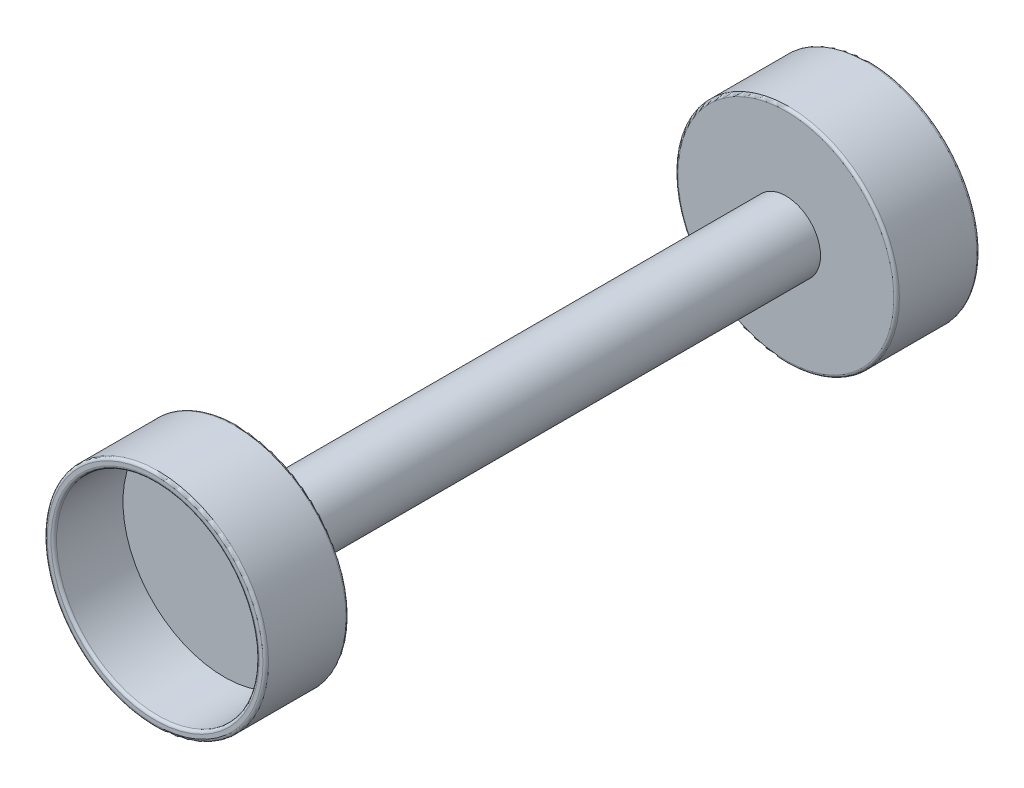
ISO-10303-21;
HEADER;
FILE_DESCRIPTION(('STEP AP214'),'2;1');
FILE_NAME('part.step','',(''),(''),'','','');
FILE_SCHEMA(('AUTOMOTIVE_DESIGN { 1 0 10303 214 1 1 1 1 }'));
ENDSEC;
DATA;
#1=APPLICATION_CONTEXT('core data for automotive mechanical design processes');
#2=APPLICATION_PROTOCOL_DEFINITION('international standard','automotive_design',2000,#1);
#3=PRODUCT_CONTEXT('',#1,'mechanical');
#4=PRODUCT('Part','Part','',(#3));
#5=PRODUCT_RELATED_PRODUCT_CATEGORY('part','',(#4));
#6=PRODUCT_DEFINITION_FORMATION('','',#4);
#7=PRODUCT_DEFINITION_CONTEXT('part definition',#1,'design');
#8=PRODUCT_DEFINITION('design','',#6,#7);
#9=PRODUCT_DEFINITION_SHAPE('','',#8);
#10=(LENGTH_UNIT() NAMED_UNIT(*) SI_UNIT(.MILLI.,.METRE.));
#11=(NAMED_UNIT(*) PLANE_ANGLE_UNIT() SI_UNIT($,.RADIAN.));
#12=(NAMED_UNIT(*) SI_UNIT($,.STERADIAN.) SOLID_ANGLE_UNIT());
#13=UNCERTAINTY_MEASURE_WITH_UNIT(LENGTH_MEASURE(1.E-05),#10,'distance_accuracy_value','');
#14=(GEOMETRIC_REPRESENTATION_CONTEXT(3) GLOBAL_UNCERTAINTY_ASSIGNED_CONTEXT((#13)) GLOBAL_UNIT_ASSIGNED_CONTEXT((#10,
#11,#12)) REPRESENTATION_CONTEXT('',''));
#15=CARTESIAN_POINT('',(0.,0.,0.));
#16=DIRECTION('',(0.,0.,1.));
#17=DIRECTION('',(1.,0.,0.));
#18=AXIS2_PLACEMENT_3D('',#15,#16,#17);
#19=CARTESIAN_POINT('',(0.,0.,251.46));
#20=DIRECTION('',(0.,0.,-1.));
#21=DIRECTION('',(-1.,0.,0.));
#22=AXIS2_PLACEMENT_3D('',#19,#20,#21);
#23=CYLINDRICAL_SURFACE('',#22,31.75);
#24=CARTESIAN_POINT('',(0.,0.,251.46));
#25=DIRECTION('',(0.,0.,1.));
#26=DIRECTION('',(1.,0.,0.));
#27=AXIS2_PLACEMENT_3D('',#24,#25,#26);
#28=CIRCLE('',#27,31.75);
#29=CARTESIAN_POINT('',(31.75,0.,251.46));
#30=VERTEX_POINT('',#29);
#31=EDGE_CURVE('E87',#30,#30,#28,.T.);
#32=ORIENTED_EDGE('',*,*,#31,.F.);
#33=EDGE_LOOP('',(#32));
#34=FACE_BOUND('',#33,.T.);
#35=CARTESIAN_POINT('',(0.,0.,-251.46));
#36=DIRECTION('',(0.,0.,1.));
#37=DIRECTION('',(1.,0.,0.));
#38=AXIS2_PLACEMENT_3D('',#35,#36,#37);
#39=CIRCLE('',#38,31.75);
#40=CARTESIAN_POINT('',(31.75,0.,-251.46));
#41=VERTEX_POINT('',#40);
#42=EDGE_CURVE('E88',#41,#41,#39,.T.);
#43=ORIENTED_EDGE('',*,*,#42,.T.);
#44=EDGE_LOOP('',(#43));
#45=FACE_BOUND('',#44,.T.);
#46=ADVANCED_FACE('F43',(#34,#45),#23,.T.);
#47=CARTESIAN_POINT('',(0.,0.,327.66));
#48=DIRECTION('',(0.,0.,-1.));
#49=DIRECTION('',(-1.,0.,0.));
#50=AXIS2_PLACEMENT_3D('',#47,#48,#49);
#51=CYLINDRICAL_SURFACE('',#50,101.6);
#52=CARTESIAN_POINT('',(0.,0.,254.));
#53=DIRECTION('',(0.,0.,1.));
#54=DIRECTION('',(1.,0.,0.));
#55=AXIS2_PLACEMENT_3D('',#52,#53,#54);
#56=CIRCLE('',#55,101.6);
#57=CARTESIAN_POINT('',(-101.6,0.,254.));
#58=VERTEX_POINT('',#57);
#59=EDGE_CURVE('E75',#58,#58,#56,.T.);
#60=CARTESIAN_POINT('',(0.,0.,325.12));
#61=DIRECTION('',(0.,0.,1.));
#62=DIRECTION('',(1.,0.,0.));
#63=AXIS2_PLACEMENT_3D('',#60,#61,#62);
#64=CIRCLE('',#63,101.6);
#65=CARTESIAN_POINT('',(-101.6,0.,325.12));
#66=VERTEX_POINT('',#65);
#67=EDGE_CURVE('E78',#66,#66,#64,.F.);
#68=CARTESIAN_POINT('',(-101.6,0.,254.));
#69=CARTESIAN_POINT('',(-101.6,0.,254.740833333333));
#70=CARTESIAN_POINT('',(-101.6,0.,255.481666666667));
#71=CARTESIAN_POINT('',(-101.6,0.,256.963333333333));
#72=CARTESIAN_POINT('',(-101.6,0.,257.704166666667));
#73=CARTESIAN_POINT('',(-101.6,0.,259.185833333333));
#74=CARTESIAN_POINT('',(-101.6,0.,259.926666666667));
#75=CARTESIAN_POINT('',(-101.6,0.,261.408333333333));
#76=CARTESIAN_POINT('',(-101.6,0.,262.149166666667));
#77=CARTESIAN_POINT('',(-101.6,0.,263.630833333333));
#78=CARTESIAN_POINT('',(-101.6,0.,264.371666666667));
#79=CARTESIAN_POINT('',(-101.6,0.,265.853333333333));
#80=CARTESIAN_POINT('',(-101.6,0.,266.594166666667));
#81=CARTESIAN_POINT('',(-101.6,0.,268.075833333333));
#82=CARTESIAN_POINT('',(-101.6,0.,268.816666666667));
#83=CARTESIAN_POINT('',(-101.6,0.,270.298333333333));
#84=CARTESIAN_POINT('',(-101.6,0.,271.039166666667));
#85=CARTESIAN_POINT('',(-101.6,0.,272.520833333333));
#86=CARTESIAN_POINT('',(-101.6,0.,273.261666666667));
#87=CARTESIAN_POINT('',(-101.6,0.,274.743333333333));
#88=CARTESIAN_POINT('',(-101.6,0.,275.484166666667));
#89=CARTESIAN_POINT('',(-101.6,0.,276.965833333333));
#90=CARTESIAN_POINT('',(-101.6,0.,277.706666666667));
#91=CARTESIAN_POINT('',(-101.6,0.,279.188333333333));
#92=CARTESIAN_POINT('',(-101.6,0.,279.929166666667));
#93=CARTESIAN_POINT('',(-101.6,0.,281.410833333333));
#94=CARTESIAN_POINT('',(-101.6,0.,282.151666666667));
#95=CARTESIAN_POINT('',(-101.6,0.,283.633333333333));
#96=CARTESIAN_POINT('',(-101.6,0.,284.374166666667));
#97=CARTESIAN_POINT('',(-101.6,0.,285.855833333333));
#98=CARTESIAN_POINT('',(-101.6,0.,286.596666666667));
#99=CARTESIAN_POINT('',(-101.6,0.,288.078333333333));
#100=CARTESIAN_POINT('',(-101.6,0.,288.819166666667));
#101=CARTESIAN_POINT('',(-101.6,0.,290.300833333333));
#102=CARTESIAN_POINT('',(-101.6,0.,291.041666666667));
#103=CARTESIAN_POINT('',(-101.6,0.,292.523333333333));
#104=CARTESIAN_POINT('',(-101.6,0.,293.264166666667));
#105=CARTESIAN_POINT('',(-101.6,0.,294.745833333333));
#106=CARTESIAN_POINT('',(-101.6,0.,295.486666666667));
#107=CARTESIAN_POINT('',(-101.6,0.,296.968333333333));
#108=CARTESIAN_POINT('',(-101.6,0.,297.709166666667));
#109=CARTESIAN_POINT('',(-101.6,0.,299.190833333333));
#110=CARTESIAN_POINT('',(-101.6,0.,299.931666666667));
#111=CARTESIAN_POINT('',(-101.6,0.,301.413333333333));
#112=CARTESIAN_POINT('',(-101.6,0.,302.154166666667));
#113=CARTESIAN_POINT('',(-101.6,0.,303.635833333333));
#114=CARTESIAN_POINT('',(-101.6,0.,304.376666666667));
#115=CARTESIAN_POINT('',(-101.6,0.,305.858333333333));
#116=CARTESIAN_POINT('',(-101.6,0.,306.599166666667));
#117=CARTESIAN_POINT('',(-101.6,0.,308.080833333333));
#118=CARTESIAN_POINT('',(-101.6,0.,308.821666666667));
#119=CARTESIAN_POINT('',(-101.6,0.,310.303333333333));
#120=CARTESIAN_POINT('',(-101.6,0.,311.044166666667));
#121=CARTESIAN_POINT('',(-101.6,0.,312.525833333333));
#122=CARTESIAN_POINT('',(-101.6,0.,313.266666666667));
#123=CARTESIAN_POINT('',(-101.6,0.,314.748333333333));
#124=CARTESIAN_POINT('',(-101.6,0.,315.489166666667));
#125=CARTESIAN_POINT('',(-101.6,0.,316.970833333333));
#126=CARTESIAN_POINT('',(-101.6,0.,317.711666666667));
#127=CARTESIAN_POINT('',(-101.6,0.,319.193333333333));
#128=CARTESIAN_POINT('',(-101.6,0.,319.934166666667));
#129=CARTESIAN_POINT('',(-101.6,0.,321.415833333333));
#130=CARTESIAN_POINT('',(-101.6,0.,322.156666666667));
#131=CARTESIAN_POINT('',(-101.6,0.,323.638333333333));
#132=CARTESIAN_POINT('',(-101.6,0.,324.379166666667));
#133=CARTESIAN_POINT('',(-101.6,0.,325.12));
#134=B_SPLINE_CURVE_WITH_KNOTS('',3,(#68,#69,#70,#71,#72,#73,#74,#75,#76,#77,#78,#79,#80,#81,
#82,#83,#84,#85,#86,#87,#88,#89,#90,#91,#92,#93,#94,#95,#96,#97,#98,#99,#100,#101,#102,#103,
#104,#105,#106,#107,#108,#109,#110,#111,#112,#113,#114,#115,#116,#117,#118,#119,#120,#121,#122,
#123,#124,#125,#126,#127,#128,#129,#130,#131,#132,#133),.UNSPECIFIED.,.F.,.F.,(4,2,2,2,2,2,2,2,
2,2,2,2,2,2,2,2,2,2,2,2,2,2,2,2,2,2,2,2,2,2,2,2,4),(0.,2.22250000000002,4.44500000000003,
6.66749999999999,8.89000000000001,11.1125,13.335,15.5575,17.78,20.0025,22.225,24.4475,26.67,
28.8925,31.115,33.3375,35.56,37.7825000000001,40.005,42.2275,44.45,46.6725,48.895,51.1175,
53.3400000000001,55.5625,57.785,60.0075000000001,62.2300000000001,64.4525,66.675,
68.8975000000001,71.1200000000001),.UNSPECIFIED.);
#135=EDGE_CURVE('BSEAM117',#58,#66,#134,.T.);
#136=ORIENTED_EDGE('',*,*,#59,.T.);
#137=ORIENTED_EDGE('',*,*,#67,.T.);
#138=ORIENTED_EDGE('',*,*,#135,.T.);
#139=ORIENTED_EDGE('',*,*,#135,.F.);
#140=EDGE_LOOP('',(#136,#138,#137,#139));
#141=FACE_BOUND('',#140,.T.);
#142=ADVANCED_FACE('F117',(#141),#51,.T.);
#143=CARTESIAN_POINT('',(0.,0.,327.66));
#144=DIRECTION('',(0.,0.,1.));
#145=DIRECTION('',(1.,0.,0.));
#146=AXIS2_PLACEMENT_3D('',#143,#144,#145);
#147=PLANE('',#146);
#148=CARTESIAN_POINT('',(0.,0.,327.66));
#149=DIRECTION('',(0.,0.,1.));
#150=DIRECTION('',(1.,0.,0.));
#151=AXIS2_PLACEMENT_3D('',#148,#149,#150);
#152=CIRCLE('',#151,99.06);
#153=CARTESIAN_POINT('',(99.06,0.,327.66));
#154=VERTEX_POINT('',#153);
#155=EDGE_CURVE('E69',#154,#154,#152,.T.);
#156=ORIENTED_EDGE('',*,*,#155,.T.);
#157=EDGE_LOOP('',(#156));
#158=FACE_BOUND('',#157,.T.);
#159=CARTESIAN_POINT('',(0.,0.,327.66));
#160=DIRECTION('',(0.,0.,1.));
#161=DIRECTION('',(1.,0.,0.));
#162=AXIS2_PLACEMENT_3D('',#159,#160,#161);
#163=CIRCLE('',#162,95.504);
#164=CARTESIAN_POINT('',(95.504,0.,327.66));
#165=VERTEX_POINT('',#164);
#166=EDGE_CURVE('E81',#165,#165,#163,.F.);
#167=ORIENTED_EDGE('',*,*,#166,.T.);
#168=EDGE_LOOP('',(#167));
#169=FACE_BOUND('',#168,.T.);
#170=ADVANCED_FACE('F124',(#158,#169),#147,.T.);
#171=CARTESIAN_POINT('',(0.,0.,251.46));
#172=DIRECTION('',(0.,0.,1.));
#173=DIRECTION('',(1.,0.,0.));
#174=AXIS2_PLACEMENT_3D('',#171,#172,#173);
#175=PLANE('',#174);
#176=CARTESIAN_POINT('',(0.,0.,251.46));
#177=DIRECTION('',(0.,0.,1.));
#178=DIRECTION('',(1.,0.,0.));
#179=AXIS2_PLACEMENT_3D('',#176,#177,#178);
#180=CIRCLE('',#179,99.06);
#181=CARTESIAN_POINT('',(99.06,0.,251.46));
#182=VERTEX_POINT('',#181);
#183=EDGE_CURVE('E72',#182,#182,#180,.F.);
#184=ORIENTED_EDGE('',*,*,#183,.T.);
#185=EDGE_LOOP('',(#184));
#186=FACE_BOUND('',#185,.T.);
#187=ORIENTED_EDGE('',*,*,#31,.T.);
#188=EDGE_LOOP('',(#187));
#189=FACE_BOUND('',#188,.T.);
#190=ADVANCED_FACE('F170',(#186,#189),#175,.F.);
#191=CARTESIAN_POINT('',(0.,0.,264.16));
#192=DIRECTION('',(0.,0.,1.));
#193=DIRECTION('',(1.,0.,0.));
#194=AXIS2_PLACEMENT_3D('',#191,#192,#193);
#195=CYLINDRICAL_SURFACE('',#194,92.964);
#196=CARTESIAN_POINT('',(0.,0.,325.12));
#197=DIRECTION('',(0.,0.,1.));
#198=DIRECTION('',(1.,0.,0.));
#199=AXIS2_PLACEMENT_3D('',#196,#197,#198);
#200=CIRCLE('',#199,92.964);
#201=CARTESIAN_POINT('',(92.964,0.,325.12));
#202=VERTEX_POINT('',#201);
#203=EDGE_CURVE('E84',#202,#202,#200,.T.);
#204=ORIENTED_EDGE('',*,*,#203,.T.);
#205=EDGE_LOOP('',(#204));
#206=FACE_BOUND('',#205,.T.);
#207=CARTESIAN_POINT('',(0.,0.,264.16));
#208=DIRECTION('',(0.,0.,1.));
#209=DIRECTION('',(1.,0.,0.));
#210=AXIS2_PLACEMENT_3D('',#207,#208,#209);
#211=CIRCLE('',#210,92.964);
#212=CARTESIAN_POINT('',(92.964,0.,264.16));
#213=VERTEX_POINT('',#212);
#214=EDGE_CURVE('E91',#213,#213,#211,.T.);
#215=ORIENTED_EDGE('',*,*,#214,.F.);
#216=EDGE_LOOP('',(#215));
#217=FACE_BOUND('',#216,.T.);
#218=ADVANCED_FACE('F166',(#206,#217),#195,.F.);
#219=CARTESIAN_POINT('',(0.,0.,264.16));
#220=DIRECTION('',(0.,0.,1.));
#221=DIRECTION('',(1.,0.,0.));
#222=AXIS2_PLACEMENT_3D('',#219,#220,#221);
#223=PLANE('',#222);
#224=ORIENTED_EDGE('',*,*,#214,.T.);
#225=EDGE_LOOP('',(#224));
#226=FACE_BOUND('',#225,.T.);
#227=ADVANCED_FACE('F135',(#226),#223,.T.);
#228=CARTESIAN_POINT('',(0.,0.,325.12));
#229=DIRECTION('',(0.,0.,1.));
#230=DIRECTION('',(1.,0.,0.));
#231=AXIS2_PLACEMENT_3D('',#228,#229,#230);
#232=TOROIDAL_SURFACE('',#231,95.504,2.54);
#233=ORIENTED_EDGE('',*,*,#166,.F.);
#234=EDGE_LOOP('',(#233));
#235=FACE_BOUND('',#234,.T.);
#236=ORIENTED_EDGE('',*,*,#203,.F.);
#237=EDGE_LOOP('',(#236));
#238=FACE_BOUND('',#237,.T.);
#239=ADVANCED_FACE('F131',(#235,#238),#232,.T.);
#240=CARTESIAN_POINT('',(0.,0.,254.));
#241=DIRECTION('',(0.,0.,1.));
#242=DIRECTION('',(1.,0.,0.));
#243=AXIS2_PLACEMENT_3D('',#240,#241,#242);
#244=TOROIDAL_SURFACE('',#243,99.06,2.54);
#245=ORIENTED_EDGE('',*,*,#183,.F.);
#246=EDGE_LOOP('',(#245));
#247=FACE_BOUND('',#246,.T.);
#248=ORIENTED_EDGE('',*,*,#59,.F.);
#249=EDGE_LOOP('',(#248));
#250=FACE_BOUND('',#249,.T.);
#251=ADVANCED_FACE('F134',(#247,#250),#244,.T.);
#252=CARTESIAN_POINT('',(0.,0.,325.12));
#253=DIRECTION('',(0.,0.,1.));
#254=DIRECTION('',(1.,0.,0.));
#255=AXIS2_PLACEMENT_3D('',#252,#253,#254);
#256=TOROIDAL_SURFACE('',#255,99.06,2.54);
#257=ORIENTED_EDGE('',*,*,#67,.F.);
#258=EDGE_LOOP('',(#257));
#259=FACE_BOUND('',#258,.T.);
#260=ORIENTED_EDGE('',*,*,#155,.F.);
#261=EDGE_LOOP('',(#260));
#262=FACE_BOUND('',#261,.T.);
#263=ADVANCED_FACE('F139',(#259,#262),#256,.T.);
#264=CARTESIAN_POINT('',(0.,0.,-327.66));
#265=DIRECTION('',(0.,0.,1.));
#266=DIRECTION('',(1.,0.,0.));
#267=AXIS2_PLACEMENT_3D('',#264,#265,#266);
#268=CYLINDRICAL_SURFACE('',#267,101.6);
#269=CARTESIAN_POINT('',(0.,0.,-254.));
#270=DIRECTION('',(0.,0.,-1.));
#271=DIRECTION('',(-1.,0.,0.));
#272=AXIS2_PLACEMENT_3D('',#269,#270,#271);
#273=CIRCLE('',#272,101.6);
#274=CARTESIAN_POINT('',(101.6,0.,-254.));
#275=VERTEX_POINT('',#274);
#276=EDGE_CURVE('E50',#275,#275,#273,.T.);
#277=CARTESIAN_POINT('',(0.,0.,-325.12));
#278=DIRECTION('',(0.,0.,-1.));
#279=DIRECTION('',(-1.,0.,0.));
#280=AXIS2_PLACEMENT_3D('',#277,#278,#279);
#281=CIRCLE('',#280,101.6);
#282=CARTESIAN_POINT('',(101.6,0.,-325.12));
#283=VERTEX_POINT('',#282);
#284=EDGE_CURVE('E54',#283,#283,#281,.F.);
#285=CARTESIAN_POINT('',(101.6,0.,-254.));
#286=CARTESIAN_POINT('',(101.6,0.,-254.740833333333));
#287=CARTESIAN_POINT('',(101.6,0.,-255.481666666667));
#288=CARTESIAN_POINT('',(101.6,0.,-256.963333333333));
#289=CARTESIAN_POINT('',(101.6,0.,-257.704166666667));
#290=CARTESIAN_POINT('',(101.6,0.,-259.185833333333));
#291=CARTESIAN_POINT('',(101.6,0.,-259.926666666667));
#292=CARTESIAN_POINT('',(101.6,0.,-261.408333333333));
#293=CARTESIAN_POINT('',(101.6,0.,-262.149166666667));
#294=CARTESIAN_POINT('',(101.6,0.,-263.630833333333));
#295=CARTESIAN_POINT('',(101.6,0.,-264.371666666667));
#296=CARTESIAN_POINT('',(101.6,0.,-265.853333333333));
#297=CARTESIAN_POINT('',(101.6,0.,-266.594166666667));
#298=CARTESIAN_POINT('',(101.6,0.,-268.075833333333));
#299=CARTESIAN_POINT('',(101.6,0.,-268.816666666667));
#300=CARTESIAN_POINT('',(101.6,0.,-270.298333333333));
#301=CARTESIAN_POINT('',(101.6,0.,-271.039166666667));
#302=CARTESIAN_POINT('',(101.6,0.,-272.520833333333));
#303=CARTESIAN_POINT('',(101.6,0.,-273.261666666667));
#304=CARTESIAN_POINT('',(101.6,0.,-274.743333333333));
#305=CARTESIAN_POINT('',(101.6,0.,-275.484166666667));
#306=CARTESIAN_POINT('',(101.6,0.,-276.965833333333));
#307=CARTESIAN_POINT('',(101.6,0.,-277.706666666667));
#308=CARTESIAN_POINT('',(101.6,0.,-279.188333333333));
#309=CARTESIAN_POINT('',(101.6,0.,-279.929166666667));
#310=CARTESIAN_POINT('',(101.6,0.,-281.410833333333));
#311=CARTESIAN_POINT('',(101.6,0.,-282.151666666667));
#312=CARTESIAN_POINT('',(101.6,0.,-283.633333333333));
#313=CARTESIAN_POINT('',(101.6,0.,-284.374166666667));
#314=CARTESIAN_POINT('',(101.6,0.,-285.855833333333));
#315=CARTESIAN_POINT('',(101.6,0.,-286.596666666667));
#316=CARTESIAN_POINT('',(101.6,0.,-288.078333333333));
#317=CARTESIAN_POINT('',(101.6,0.,-288.819166666667));
#318=CARTESIAN_POINT('',(101.6,0.,-290.300833333333));
#319=CARTESIAN_POINT('',(101.6,0.,-291.041666666667));
#320=CARTESIAN_POINT('',(101.6,0.,-292.523333333333));
#321=CARTESIAN_POINT('',(101.6,0.,-293.264166666667));
#322=CARTESIAN_POINT('',(101.6,0.,-294.745833333333));
#323=CARTESIAN_POINT('',(101.6,0.,-295.486666666667));
#324=CARTESIAN_POINT('',(101.6,0.,-296.968333333333));
#325=CARTESIAN_POINT('',(101.6,0.,-297.709166666667));
#326=CARTESIAN_POINT('',(101.6,0.,-299.190833333333));
#327=CARTESIAN_POINT('',(101.6,0.,-299.931666666667));
#328=CARTESIAN_POINT('',(101.6,0.,-301.413333333333));
#329=CARTESIAN_POINT('',(101.6,0.,-302.154166666667));
#330=CARTESIAN_POINT('',(101.6,0.,-303.635833333333));
#331=CARTESIAN_POINT('',(101.6,0.,-304.376666666667));
#332=CARTESIAN_POINT('',(101.6,0.,-305.858333333333));
#333=CARTESIAN_POINT('',(101.6,0.,-306.599166666667));
#334=CARTESIAN_POINT('',(101.6,0.,-308.080833333333));
#335=CARTESIAN_POINT('',(101.6,0.,-308.821666666667));
#336=CARTESIAN_POINT('',(101.6,0.,-310.303333333333));
#337=CARTESIAN_POINT('',(101.6,0.,-311.044166666667));
#338=CARTESIAN_POINT('',(101.6,0.,-312.525833333333));
#339=CARTESIAN_POINT('',(101.6,0.,-313.266666666667));
#340=CARTESIAN_POINT('',(101.6,0.,-314.748333333333));
#341=CARTESIAN_POINT('',(101.6,0.,-315.489166666667));
#342=CARTESIAN_POINT('',(101.6,0.,-316.970833333333));
#343=CARTESIAN_POINT('',(101.6,0.,-317.711666666667));
#344=CARTESIAN_POINT('',(101.6,0.,-319.193333333333));
#345=CARTESIAN_POINT('',(101.6,0.,-319.934166666667));
#346=CARTESIAN_POINT('',(101.6,0.,-321.415833333333));
#347=CARTESIAN_POINT('',(101.6,0.,-322.156666666667));
#348=CARTESIAN_POINT('',(101.6,0.,-323.638333333333));
#349=CARTESIAN_POINT('',(101.6,0.,-324.379166666667));
#350=CARTESIAN_POINT('',(101.6,0.,-325.12));
#351=B_SPLINE_CURVE_WITH_KNOTS('',3,(#285,#286,#287,#288,#289,#290,#291,#292,#293,#294,#295,
#296,#297,#298,#299,#300,#301,#302,#303,#304,#305,#306,#307,#308,#309,#310,#311,#312,#313,#314,
#315,#316,#317,#318,#319,#320,#321,#322,#323,#324,#325,#326,#327,#328,#329,#330,#331,#332,#333,
#334,#335,#336,#337,#338,#339,#340,#341,#342,#343,#344,#345,#346,#347,#348,#349,#350),
.UNSPECIFIED.,.F.,.F.,(4,2,2,2,2,2,2,2,2,2,2,2,2,2,2,2,2,2,2,2,2,2,2,2,2,2,2,2,2,2,2,2,4),(0.,
2.22250000000002,4.44500000000003,6.66749999999999,8.89000000000001,11.1125,13.335,15.5575,
17.78,20.0025,22.225,24.4475,26.67,28.8925,31.115,33.3375,35.56,37.7825000000001,40.005,42.2275,
44.45,46.6725,48.895,51.1175,53.3400000000001,55.5625,57.785,60.0075000000001,62.2300000000001,
64.4525,66.675,68.8975000000001,71.1200000000001),.UNSPECIFIED.);
#352=EDGE_CURVE('BSEAM142',#275,#283,#351,.T.);
#353=ORIENTED_EDGE('',*,*,#276,.T.);
#354=ORIENTED_EDGE('',*,*,#284,.T.);
#355=ORIENTED_EDGE('',*,*,#352,.T.);
#356=ORIENTED_EDGE('',*,*,#352,.F.);
#357=EDGE_LOOP('',(#353,#355,#354,#356));
#358=FACE_BOUND('',#357,.T.);
#359=ADVANCED_FACE('F142',(#358),#268,.T.);
#360=CARTESIAN_POINT('',(0.,0.,-327.66));
#361=DIRECTION('',(0.,0.,-1.));
#362=DIRECTION('',(1.,0.,0.));
#363=AXIS2_PLACEMENT_3D('',#360,#361,#362);
#364=PLANE('',#363);
#365=CARTESIAN_POINT('',(0.,0.,-327.66));
#366=DIRECTION('',(0.,0.,-1.));
#367=DIRECTION('',(-1.,0.,0.));
#368=AXIS2_PLACEMENT_3D('',#365,#366,#367);
#369=CIRCLE('',#368,99.06);
#370=CARTESIAN_POINT('',(-99.06,0.,-327.66));
#371=VERTEX_POINT('',#370);
#372=EDGE_CURVE('E10',#371,#371,#369,.T.);
#373=ORIENTED_EDGE('',*,*,#372,.T.);
#374=EDGE_LOOP('',(#373));
#375=FACE_BOUND('',#374,.T.);
#376=CARTESIAN_POINT('',(0.,0.,-327.66));
#377=DIRECTION('',(0.,0.,-1.));
#378=DIRECTION('',(-1.,0.,0.));
#379=AXIS2_PLACEMENT_3D('',#376,#377,#378);
#380=CIRCLE('',#379,95.504);
#381=CARTESIAN_POINT('',(-95.504,0.,-327.66));
#382=VERTEX_POINT('',#381);
#383=EDGE_CURVE('E66',#382,#382,#380,.F.);
#384=ORIENTED_EDGE('',*,*,#383,.T.);
#385=EDGE_LOOP('',(#384));
#386=FACE_BOUND('',#385,.T.);
#387=ADVANCED_FACE('F155',(#375,#386),#364,.T.);
#388=CARTESIAN_POINT('',(0.,0.,-251.46));
#389=DIRECTION('',(0.,0.,-1.));
#390=DIRECTION('',(1.,0.,0.));
#391=AXIS2_PLACEMENT_3D('',#388,#389,#390);
#392=PLANE('',#391);
#393=CARTESIAN_POINT('',(0.,0.,-251.46));
#394=DIRECTION('',(0.,0.,-1.));
#395=DIRECTION('',(-1.,0.,0.));
#396=AXIS2_PLACEMENT_3D('',#393,#394,#395);
#397=CIRCLE('',#396,99.06);
#398=CARTESIAN_POINT('',(-99.06,0.,-251.46));
#399=VERTEX_POINT('',#398);
#400=EDGE_CURVE('E58',#399,#399,#397,.F.);
#401=ORIENTED_EDGE('',*,*,#400,.T.);
#402=EDGE_LOOP('',(#401));
#403=FACE_BOUND('',#402,.T.);
#404=ORIENTED_EDGE('',*,*,#42,.F.);
#405=EDGE_LOOP('',(#404));
#406=FACE_BOUND('',#405,.T.);
#407=ADVANCED_FACE('F113',(#403,#406),#392,.F.);
#408=CARTESIAN_POINT('',(0.,0.,-264.16));
#409=DIRECTION('',(0.,0.,-1.));
#410=DIRECTION('',(-1.,0.,0.));
#411=AXIS2_PLACEMENT_3D('',#408,#409,#410);
#412=CYLINDRICAL_SURFACE('',#411,92.964);
#413=CARTESIAN_POINT('',(0.,0.,-325.12));
#414=DIRECTION('',(0.,0.,-1.));
#415=DIRECTION('',(-1.,0.,0.));
#416=AXIS2_PLACEMENT_3D('',#413,#414,#415);
#417=CIRCLE('',#416,92.964);
#418=CARTESIAN_POINT('',(-92.964,0.,-325.12));
#419=VERTEX_POINT('',#418);
#420=EDGE_CURVE('E63',#419,#419,#417,.T.);
#421=ORIENTED_EDGE('',*,*,#420,.T.);
#422=EDGE_LOOP('',(#421));
#423=FACE_BOUND('',#422,.T.);
#424=CARTESIAN_POINT('',(0.,0.,-264.16));
#425=DIRECTION('',(0.,0.,1.));
#426=DIRECTION('',(1.,0.,0.));
#427=AXIS2_PLACEMENT_3D('',#424,#425,#426);
#428=CIRCLE('',#427,92.964);
#429=CARTESIAN_POINT('',(92.964,0.,-264.16));
#430=VERTEX_POINT('',#429);
#431=EDGE_CURVE('E92',#430,#430,#428,.T.);
#432=ORIENTED_EDGE('',*,*,#431,.T.);
#433=EDGE_LOOP('',(#432));
#434=FACE_BOUND('',#433,.T.);
#435=ADVANCED_FACE('F100',(#423,#434),#412,.F.);
#436=CARTESIAN_POINT('',(0.,0.,-264.16));
#437=DIRECTION('',(0.,0.,-1.));
#438=DIRECTION('',(1.,0.,0.));
#439=AXIS2_PLACEMENT_3D('',#436,#437,#438);
#440=PLANE('',#439);
#441=ORIENTED_EDGE('',*,*,#431,.F.);
#442=EDGE_LOOP('',(#441));
#443=FACE_BOUND('',#442,.T.);
#444=ADVANCED_FACE('F102',(#443),#440,.T.);
#445=CARTESIAN_POINT('',(0.,0.,-325.12));
#446=DIRECTION('',(0.,0.,-1.));
#447=DIRECTION('',(-1.,0.,0.));
#448=AXIS2_PLACEMENT_3D('',#445,#446,#447);
#449=TOROIDAL_SURFACE('',#448,95.504,2.54);
#450=ORIENTED_EDGE('',*,*,#420,.F.);
#451=EDGE_LOOP('',(#450));
#452=FACE_BOUND('',#451,.T.);
#453=ORIENTED_EDGE('',*,*,#383,.F.);
#454=EDGE_LOOP('',(#453));
#455=FACE_BOUND('',#454,.T.);
#456=ADVANCED_FACE('F104',(#452,#455),#449,.T.);
#457=CARTESIAN_POINT('',(0.,0.,-254.));
#458=DIRECTION('',(0.,0.,-1.));
#459=DIRECTION('',(-1.,0.,0.));
#460=AXIS2_PLACEMENT_3D('',#457,#458,#459);
#461=TOROIDAL_SURFACE('',#460,99.06,2.54);
#462=ORIENTED_EDGE('',*,*,#276,.F.);
#463=EDGE_LOOP('',(#462));
#464=FACE_BOUND('',#463,.T.);
#465=ORIENTED_EDGE('',*,*,#400,.F.);
#466=EDGE_LOOP('',(#465));
#467=FACE_BOUND('',#466,.T.);
#468=ADVANCED_FACE('F110',(#464,#467),#461,.T.);
#469=CARTESIAN_POINT('',(0.,0.,-325.12));
#470=DIRECTION('',(0.,0.,-1.));
#471=DIRECTION('',(-1.,0.,0.));
#472=AXIS2_PLACEMENT_3D('',#469,#470,#471);
#473=TOROIDAL_SURFACE('',#472,99.06,2.54);
#474=ORIENTED_EDGE('',*,*,#372,.F.);
#475=EDGE_LOOP('',(#474));
#476=FACE_BOUND('',#475,.T.);
#477=ORIENTED_EDGE('',*,*,#284,.F.);
#478=EDGE_LOOP('',(#477));
#479=FACE_BOUND('',#478,.T.);
#480=ADVANCED_FACE('F45',(#476,#479),#473,.T.);
#481=CLOSED_SHELL('',(#46,#142,#170,#190,#218,#227,#239,#251,#263,#359,#387,#407,#435,#444,#456,
#468,#480));
#482=MANIFOLD_SOLID_BREP('B2',#481);
#483=ADVANCED_BREP_SHAPE_REPRESENTATION('',(#18,#482),#14);
#484=SHAPE_DEFINITION_REPRESENTATION(#9,#483);
ENDSEC;
END-ISO-10303-21;
